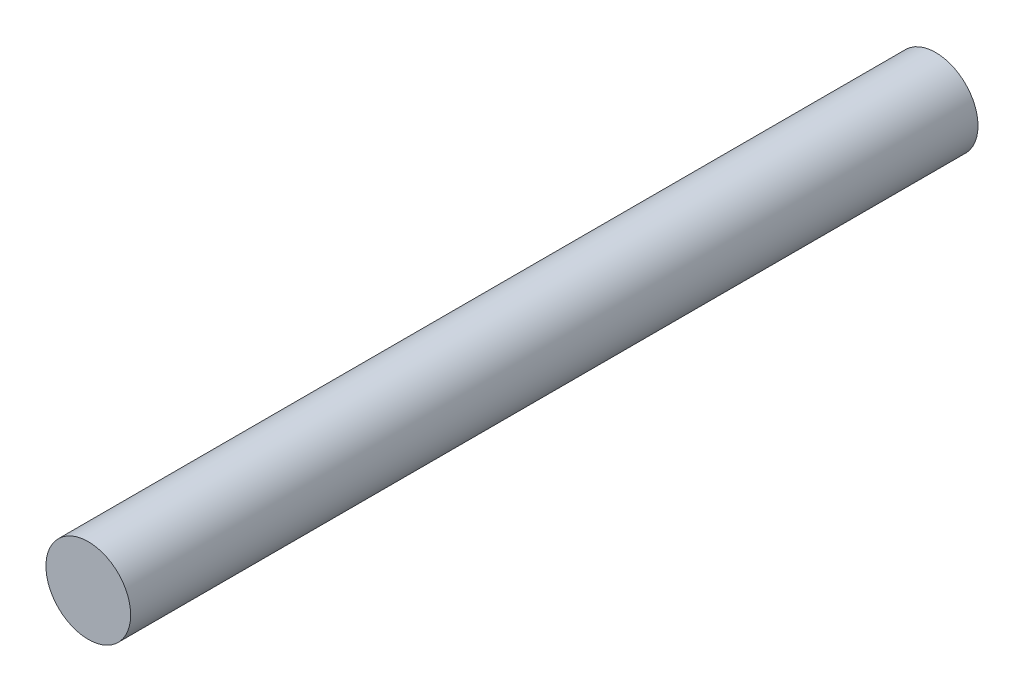
ISO-10303-21;
HEADER;
FILE_DESCRIPTION(('STEP AP214'),'2;1');
FILE_NAME('part.step','',(''),(''),'','','');
FILE_SCHEMA(('AUTOMOTIVE_DESIGN { 1 0 10303 214 1 1 1 1 }'));
ENDSEC;
DATA;
#1=APPLICATION_CONTEXT('core data for automotive mechanical design processes');
#2=APPLICATION_PROTOCOL_DEFINITION('international standard','automotive_design',2000,#1);
#3=PRODUCT_CONTEXT('',#1,'mechanical');
#4=PRODUCT('Part','Part','',(#3));
#5=PRODUCT_RELATED_PRODUCT_CATEGORY('part','',(#4));
#6=PRODUCT_DEFINITION_FORMATION('','',#4);
#7=PRODUCT_DEFINITION_CONTEXT('part definition',#1,'design');
#8=PRODUCT_DEFINITION('design','',#6,#7);
#9=PRODUCT_DEFINITION_SHAPE('','',#8);
#10=(LENGTH_UNIT() NAMED_UNIT(*) SI_UNIT(.MILLI.,.METRE.));
#11=(NAMED_UNIT(*) PLANE_ANGLE_UNIT() SI_UNIT($,.RADIAN.));
#12=(NAMED_UNIT(*) SI_UNIT($,.STERADIAN.) SOLID_ANGLE_UNIT());
#13=UNCERTAINTY_MEASURE_WITH_UNIT(LENGTH_MEASURE(1.E-05),#10,'distance_accuracy_value','');
#14=(GEOMETRIC_REPRESENTATION_CONTEXT(3) GLOBAL_UNCERTAINTY_ASSIGNED_CONTEXT((#13)) GLOBAL_UNIT_ASSIGNED_CONTEXT((#10,
#11,#12)) REPRESENTATION_CONTEXT('',''));
#15=CARTESIAN_POINT('',(0.,0.,0.));
#16=DIRECTION('',(0.,0.,1.));
#17=DIRECTION('',(1.,0.,0.));
#18=AXIS2_PLACEMENT_3D('',#15,#16,#17);
#19=CARTESIAN_POINT('',(0.,0.,100.));
#20=DIRECTION('',(0.,0.,-1.));
#21=DIRECTION('',(-1.,0.,0.));
#22=AXIS2_PLACEMENT_3D('',#19,#20,#21);
#23=CYLINDRICAL_SURFACE('',#22,5.);
#24=CARTESIAN_POINT('',(0.,0.,100.));
#25=DIRECTION('',(0.,0.,1.));
#26=DIRECTION('',(1.,0.,0.));
#27=AXIS2_PLACEMENT_3D('',#24,#25,#26);
#28=CIRCLE('',#27,5.);
#29=CARTESIAN_POINT('',(5.,0.,100.));
#30=VERTEX_POINT('',#29);
#31=EDGE_CURVE('E10',#30,#30,#28,.T.);
#32=ORIENTED_EDGE('',*,*,#31,.F.);
#33=EDGE_LOOP('',(#32));
#34=FACE_BOUND('',#33,.T.);
#35=CARTESIAN_POINT('',(0.,0.,0.));
#36=DIRECTION('',(0.,0.,1.));
#37=DIRECTION('',(1.,0.,0.));
#38=AXIS2_PLACEMENT_3D('',#35,#36,#37);
#39=CIRCLE('',#38,5.);
#40=CARTESIAN_POINT('',(5.,0.,0.));
#41=VERTEX_POINT('',#40);
#42=EDGE_CURVE('E40',#41,#41,#39,.T.);
#43=ORIENTED_EDGE('',*,*,#42,.T.);
#44=EDGE_LOOP('',(#43));
#45=FACE_BOUND('',#44,.T.);
#46=ADVANCED_FACE('F37',(#34,#45),#23,.T.);
#47=CARTESIAN_POINT('',(0.,0.,100.));
#48=DIRECTION('',(0.,0.,1.));
#49=DIRECTION('',(1.,0.,0.));
#50=AXIS2_PLACEMENT_3D('',#47,#48,#49);
#51=PLANE('',#50);
#52=ORIENTED_EDGE('',*,*,#31,.T.);
#53=EDGE_LOOP('',(#52));
#54=FACE_BOUND('',#53,.T.);
#55=ADVANCED_FACE('F54',(#54),#51,.T.);
#56=CARTESIAN_POINT('',(0.,0.,0.));
#57=DIRECTION('',(0.,0.,1.));
#58=DIRECTION('',(1.,0.,0.));
#59=AXIS2_PLACEMENT_3D('',#56,#57,#58);
#60=PLANE('',#59);
#61=ORIENTED_EDGE('',*,*,#42,.F.);
#62=EDGE_LOOP('',(#61));
#63=FACE_BOUND('',#62,.T.);
#64=ADVANCED_FACE('F52',(#63),#60,.F.);
#65=CLOSED_SHELL('',(#46,#55,#64));
#66=MANIFOLD_SOLID_BREP('B2',#65);
#67=ADVANCED_BREP_SHAPE_REPRESENTATION('',(#18,#66),#14);
#68=SHAPE_DEFINITION_REPRESENTATION(#9,#67);
ENDSEC;
END-ISO-10303-21;
